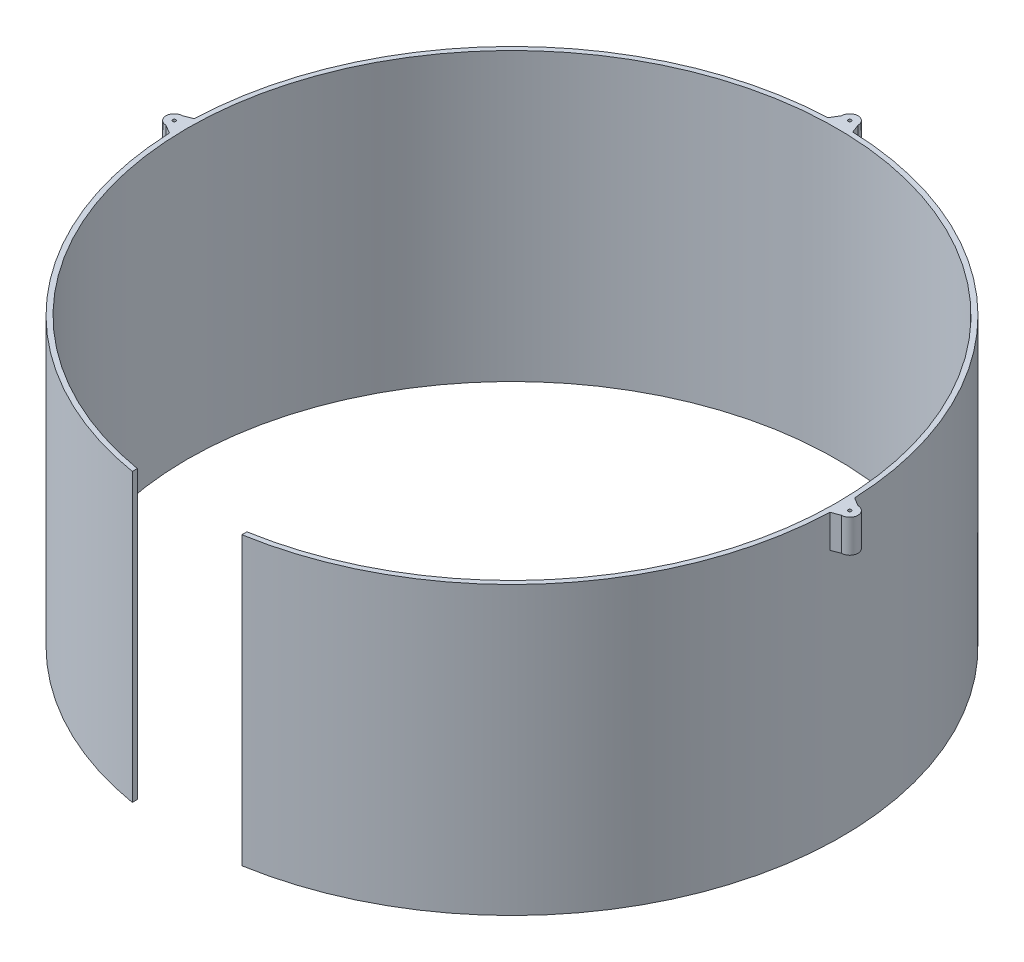
ISO-10303-21;
HEADER;
FILE_DESCRIPTION(('STEP AP214'),'2;1');
FILE_NAME('part.step','',(''),(''),'','','');
FILE_SCHEMA(('AUTOMOTIVE_DESIGN { 1 0 10303 214 1 1 1 1 }'));
ENDSEC;
DATA;
#1=APPLICATION_CONTEXT('core data for automotive mechanical design processes');
#2=APPLICATION_PROTOCOL_DEFINITION('international standard','automotive_design',2000,#1);
#3=PRODUCT_CONTEXT('',#1,'mechanical');
#4=PRODUCT('Part','Part','',(#3));
#5=PRODUCT_RELATED_PRODUCT_CATEGORY('part','',(#4));
#6=PRODUCT_DEFINITION_FORMATION('','',#4);
#7=PRODUCT_DEFINITION_CONTEXT('part definition',#1,'design');
#8=PRODUCT_DEFINITION('design','',#6,#7);
#9=PRODUCT_DEFINITION_SHAPE('','',#8);
#10=(LENGTH_UNIT() NAMED_UNIT(*) SI_UNIT(.MILLI.,.METRE.));
#11=(NAMED_UNIT(*) PLANE_ANGLE_UNIT() SI_UNIT($,.RADIAN.));
#12=(NAMED_UNIT(*) SI_UNIT($,.STERADIAN.) SOLID_ANGLE_UNIT());
#13=UNCERTAINTY_MEASURE_WITH_UNIT(LENGTH_MEASURE(1.E-05),#10,'distance_accuracy_value','');
#14=(GEOMETRIC_REPRESENTATION_CONTEXT(3) GLOBAL_UNCERTAINTY_ASSIGNED_CONTEXT((#13)) GLOBAL_UNIT_ASSIGNED_CONTEXT((#10,
#11,#12)) REPRESENTATION_CONTEXT('',''));
#15=CARTESIAN_POINT('',(0.,0.,0.));
#16=DIRECTION('',(0.,0.,1.));
#17=DIRECTION('',(1.,0.,0.));
#18=AXIS2_PLACEMENT_3D('',#15,#16,#17);
#19=CARTESIAN_POINT('',(0.,87.,0.));
#20=DIRECTION('',(0.,-1.,0.));
#21=DIRECTION('',(0.,0.,-1.));
#22=AXIS2_PLACEMENT_3D('',#19,#20,#21);
#23=CYLINDRICAL_SURFACE('',#22,98.5);
#24=CARTESIAN_POINT('',(0.,0.,0.));
#25=DIRECTION('',(0.,-1.,0.));
#26=DIRECTION('',(0.,0.,1.));
#27=AXIS2_PLACEMENT_3D('',#24,#25,#26);
#28=CIRCLE('',#27,98.5);
#29=CARTESIAN_POINT('',(-16.6342622863779,0.,97.0852785863438));
#30=VERTEX_POINT('',#29);
#31=CARTESIAN_POINT('',(16.6342622863779,0.,97.0852785863438));
#32=VERTEX_POINT('',#31);
#33=EDGE_CURVE('E295',#30,#32,#28,.T.);
#34=ORIENTED_EDGE('',*,*,#33,.T.);
#35=DIRECTION('',(0.,-1.,0.));
#36=VECTOR('',#35,1.);
#37=CARTESIAN_POINT('',(16.6342622863779,87.,97.0852785863438));
#38=LINE('',#37,#36);
#39=CARTESIAN_POINT('',(16.6342622863779,87.,97.0852785863438));
#40=VERTEX_POINT('',#39);
#41=EDGE_CURVE('E336',#40,#32,#38,.T.);
#42=ORIENTED_EDGE('',*,*,#41,.F.);
#43=CARTESIAN_POINT('',(0.,87.,0.));
#44=DIRECTION('',(0.,-1.,0.));
#45=DIRECTION('',(0.,0.,1.));
#46=AXIS2_PLACEMENT_3D('',#43,#44,#45);
#47=CIRCLE('',#46,98.5);
#48=CARTESIAN_POINT('',(-16.6342622863779,87.,97.0852785863438));
#49=VERTEX_POINT('',#48);
#50=EDGE_CURVE('E296',#49,#40,#47,.T.);
#51=ORIENTED_EDGE('',*,*,#50,.F.);
#52=DIRECTION('',(0.,-1.,0.));
#53=VECTOR('',#52,1.);
#54=CARTESIAN_POINT('',(-16.6342622863779,87.,97.0852785863438));
#55=LINE('',#54,#53);
#56=EDGE_CURVE('E313',#49,#30,#55,.T.);
#57=ORIENTED_EDGE('',*,*,#56,.T.);
#58=EDGE_LOOP('',(#34,#42,#51,#57));
#59=FACE_BOUND('',#58,.T.);
#60=ADVANCED_FACE('F45',(#59),#23,.F.);
#61=CARTESIAN_POINT('',(16.6342622863779,87.,97.0852785863438));
#62=DIRECTION('',(1.,0.,0.));
#63=DIRECTION('',(0.,0.,-1.));
#64=AXIS2_PLACEMENT_3D('',#61,#62,#63);
#65=PLANE('',#64);
#66=DIRECTION('',(0.,0.,1.));
#67=VECTOR('',#66,1.);
#68=CARTESIAN_POINT('',(16.6342622863779,0.,97.0852785863438));
#69=LINE('',#68,#67);
#70=CARTESIAN_POINT('',(16.6342622863779,0.,98.6068015817772));
#71=VERTEX_POINT('',#70);
#72=EDGE_CURVE('E317',#32,#71,#69,.T.);
#73=ORIENTED_EDGE('',*,*,#72,.T.);
#74=DIRECTION('',(0.,-1.,0.));
#75=VECTOR('',#74,1.);
#76=CARTESIAN_POINT('',(16.6342622863779,87.,98.6068015817772));
#77=LINE('',#76,#75);
#78=CARTESIAN_POINT('',(16.6342622863779,87.,98.6068015817772));
#79=VERTEX_POINT('',#78);
#80=EDGE_CURVE('E332',#79,#71,#77,.T.);
#81=ORIENTED_EDGE('',*,*,#80,.F.);
#82=DIRECTION('',(0.,0.,1.));
#83=VECTOR('',#82,1.);
#84=CARTESIAN_POINT('',(16.6342622863779,87.,97.0852785863438));
#85=LINE('',#84,#83);
#86=EDGE_CURVE('E300',#40,#79,#85,.T.);
#87=ORIENTED_EDGE('',*,*,#86,.F.);
#88=ORIENTED_EDGE('',*,*,#41,.T.);
#89=EDGE_LOOP('',(#73,#81,#87,#88));
#90=FACE_BOUND('',#89,.T.);
#91=ADVANCED_FACE('F374',(#90),#65,.F.);
#92=CARTESIAN_POINT('',(0.,87.,0.));
#93=DIRECTION('',(0.,-1.,0.));
#94=DIRECTION('',(0.,0.,-1.));
#95=AXIS2_PLACEMENT_3D('',#92,#93,#94);
#96=CYLINDRICAL_SURFACE('',#95,100.);
#97=CARTESIAN_POINT('',(0.,77.,0.));
#98=DIRECTION('',(0.,1.,0.));
#99=DIRECTION('',(0.,0.,1.));
#100=AXIS2_PLACEMENT_3D('',#97,#98,#99);
#101=CIRCLE('',#100,100.);
#102=CARTESIAN_POINT('',(3.48175720560747,77.,-99.9393684528835));
#103=VERTEX_POINT('',#102);
#104=CARTESIAN_POINT('',(-4.05153192682662,77.,-99.9178917363948));
#105=VERTEX_POINT('',#104);
#106=EDGE_CURVE('E11',#103,#105,#101,.T.);
#107=ORIENTED_EDGE('',*,*,#106,.F.);
#108=DIRECTION('',(0.,-1.,0.));
#109=VECTOR('',#108,1.);
#110=CARTESIAN_POINT('',(3.48175720560747,87.,-99.9393684528835));
#111=LINE('',#110,#109);
#112=CARTESIAN_POINT('',(3.48175720560747,87.,-99.9393684528835));
#113=VERTEX_POINT('',#112);
#114=EDGE_CURVE('E206',#103,#113,#111,.F.);
#115=ORIENTED_EDGE('',*,*,#114,.T.);
#116=CARTESIAN_POINT('',(0.,87.,0.));
#117=DIRECTION('',(0.,1.,0.));
#118=DIRECTION('',(0.,0.,1.));
#119=AXIS2_PLACEMENT_3D('',#116,#117,#118);
#120=CIRCLE('',#119,100.);
#121=CARTESIAN_POINT('',(99.9178917363948,87.,-4.05153192682659));
#122=VERTEX_POINT('',#121);
#123=EDGE_CURVE('E163',#122,#113,#120,.T.);
#124=ORIENTED_EDGE('',*,*,#123,.F.);
#125=DIRECTION('',(0.,-1.,0.));
#126=VECTOR('',#125,1.);
#127=CARTESIAN_POINT('',(99.9178917363948,87.,-4.05153192682657));
#128=LINE('',#127,#126);
#129=CARTESIAN_POINT('',(99.9178917363948,77.,-4.05153192682657));
#130=VERTEX_POINT('',#129);
#131=EDGE_CURVE('E240',#122,#130,#128,.T.);
#132=ORIENTED_EDGE('',*,*,#131,.T.);
#133=CARTESIAN_POINT('',(0.,77.,0.));
#134=DIRECTION('',(0.,1.,0.));
#135=DIRECTION('',(0.,0.,1.));
#136=AXIS2_PLACEMENT_3D('',#133,#134,#135);
#137=CIRCLE('',#136,100.);
#138=CARTESIAN_POINT('',(99.9393684528835,77.,3.48175720560755));
#139=VERTEX_POINT('',#138);
#140=EDGE_CURVE('E53',#139,#130,#137,.T.);
#141=ORIENTED_EDGE('',*,*,#140,.F.);
#142=DIRECTION('',(0.,-1.,0.));
#143=VECTOR('',#142,1.);
#144=CARTESIAN_POINT('',(99.9393684528835,87.,3.48175720560755));
#145=LINE('',#144,#143);
#146=CARTESIAN_POINT('',(99.9393684528835,87.,3.48175720560754));
#147=VERTEX_POINT('',#146);
#148=EDGE_CURVE('E247',#139,#147,#145,.F.);
#149=ORIENTED_EDGE('',*,*,#148,.T.);
#150=EDGE_CURVE('E305',#79,#147,#120,.T.);
#151=ORIENTED_EDGE('',*,*,#150,.F.);
#152=ORIENTED_EDGE('',*,*,#80,.T.);
#153=CARTESIAN_POINT('',(0.,0.,0.));
#154=DIRECTION('',(0.,1.,0.));
#155=DIRECTION('',(0.,0.,1.));
#156=AXIS2_PLACEMENT_3D('',#153,#154,#155);
#157=CIRCLE('',#156,100.);
#158=CARTESIAN_POINT('',(-16.6342622863779,0.,98.6068015817772));
#159=VERTEX_POINT('',#158);
#160=EDGE_CURVE('E320',#71,#159,#157,.T.);
#161=ORIENTED_EDGE('',*,*,#160,.T.);
#162=DIRECTION('',(0.,-1.,0.));
#163=VECTOR('',#162,1.);
#164=CARTESIAN_POINT('',(-16.6342622863779,87.,98.6068015817772));
#165=LINE('',#164,#163);
#166=CARTESIAN_POINT('',(-16.6342622863779,87.,98.6068015817772));
#167=VERTEX_POINT('',#166);
#168=EDGE_CURVE('E328',#167,#159,#165,.T.);
#169=ORIENTED_EDGE('',*,*,#168,.F.);
#170=CARTESIAN_POINT('',(-99.9178917363948,87.,4.05153192682661));
#171=VERTEX_POINT('',#170);
#172=EDGE_CURVE('E304',#171,#167,#120,.T.);
#173=ORIENTED_EDGE('',*,*,#172,.F.);
#174=DIRECTION('',(0.,-1.,0.));
#175=VECTOR('',#174,1.);
#176=CARTESIAN_POINT('',(-99.9178917363948,87.,4.05153192682661));
#177=LINE('',#176,#175);
#178=CARTESIAN_POINT('',(-99.9178917363948,77.,4.05153192682661));
#179=VERTEX_POINT('',#178);
#180=EDGE_CURVE('E285',#171,#179,#177,.T.);
#181=ORIENTED_EDGE('',*,*,#180,.T.);
#182=CARTESIAN_POINT('',(0.,77.,0.));
#183=DIRECTION('',(0.,1.,0.));
#184=DIRECTION('',(0.,0.,1.));
#185=AXIS2_PLACEMENT_3D('',#182,#183,#184);
#186=CIRCLE('',#185,100.);
#187=CARTESIAN_POINT('',(-99.9393684528835,77.,-3.4817572056075));
#188=VERTEX_POINT('',#187);
#189=EDGE_CURVE('E340',#188,#179,#186,.T.);
#190=ORIENTED_EDGE('',*,*,#189,.F.);
#191=DIRECTION('',(0.,-1.,0.));
#192=VECTOR('',#191,1.);
#193=CARTESIAN_POINT('',(-99.9393684528835,87.,-3.4817572056075));
#194=LINE('',#193,#192);
#195=CARTESIAN_POINT('',(-99.9393684528835,87.,-3.4817572056075));
#196=VERTEX_POINT('',#195);
#197=EDGE_CURVE('E291',#188,#196,#194,.F.);
#198=ORIENTED_EDGE('',*,*,#197,.T.);
#199=CARTESIAN_POINT('',(-4.05153192682663,87.,-99.9178917363948));
#200=VERTEX_POINT('',#199);
#201=EDGE_CURVE('E310',#200,#196,#120,.T.);
#202=ORIENTED_EDGE('',*,*,#201,.F.);
#203=DIRECTION('',(0.,-1.,0.));
#204=VECTOR('',#203,1.);
#205=CARTESIAN_POINT('',(-4.05153192682663,87.,-99.9178917363948));
#206=LINE('',#205,#204);
#207=EDGE_CURVE('E201',#200,#105,#206,.T.);
#208=ORIENTED_EDGE('',*,*,#207,.T.);
#209=EDGE_LOOP('',(#107,#115,#124,#132,#141,#149,#151,#152,#161,#169,#173,#181,#190,#198,#202,#208));
#210=FACE_BOUND('',#209,.T.);
#211=ADVANCED_FACE('F353',(#210),#96,.T.);
#212=CARTESIAN_POINT('',(-16.6342622863779,87.,97.0852785863438));
#213=DIRECTION('',(-1.,0.,0.));
#214=DIRECTION('',(0.,0.,1.));
#215=AXIS2_PLACEMENT_3D('',#212,#213,#214);
#216=PLANE('',#215);
#217=DIRECTION('',(0.,0.,-1.));
#218=VECTOR('',#217,1.);
#219=CARTESIAN_POINT('',(-16.6342622863779,0.,97.0852785863438));
#220=LINE('',#219,#218);
#221=EDGE_CURVE('E301',#159,#30,#220,.T.);
#222=ORIENTED_EDGE('',*,*,#221,.T.);
#223=ORIENTED_EDGE('',*,*,#56,.F.);
#224=DIRECTION('',(0.,0.,-1.));
#225=VECTOR('',#224,1.);
#226=CARTESIAN_POINT('',(-16.6342622863779,87.,97.0852785863438));
#227=LINE('',#226,#225);
#228=EDGE_CURVE('E309',#167,#49,#227,.T.);
#229=ORIENTED_EDGE('',*,*,#228,.F.);
#230=ORIENTED_EDGE('',*,*,#168,.T.);
#231=EDGE_LOOP('',(#222,#223,#229,#230));
#232=FACE_BOUND('',#231,.T.);
#233=ADVANCED_FACE('F366',(#232),#216,.F.);
#234=CARTESIAN_POINT('',(0.,87.,0.));
#235=DIRECTION('',(0.,1.,0.));
#236=DIRECTION('',(0.,0.,1.));
#237=AXIS2_PLACEMENT_3D('',#234,#235,#236);
#238=PLANE('',#237);
#239=ORIENTED_EDGE('',*,*,#123,.T.);
#240=DIRECTION('',(-0.357993803681993,0.,-0.933723961631755));
#241=VECTOR('',#240,1.);
#242=CARTESIAN_POINT('',(2.5,87.,-102.5));
#243=LINE('',#242,#241);
#244=CARTESIAN_POINT('',(2.5,87.,-102.5));
#245=VERTEX_POINT('',#244);
#246=EDGE_CURVE('E156',#113,#245,#243,.T.);
#247=ORIENTED_EDGE('',*,*,#246,.T.);
#248=CARTESIAN_POINT('',(0.,87.,-102.5));
#249=DIRECTION('',(0.,1.,0.));
#250=DIRECTION('',(0.,0.,1.));
#251=AXIS2_PLACEMENT_3D('',#248,#249,#250);
#252=CIRCLE('',#251,2.5);
#253=CARTESIAN_POINT('',(-2.5,87.,-102.5));
#254=VERTEX_POINT('',#253);
#255=EDGE_CURVE('E161',#245,#254,#252,.T.);
#256=ORIENTED_EDGE('',*,*,#255,.T.);
#257=DIRECTION('',(-0.515048991321095,0.,0.857160741366007));
#258=VECTOR('',#257,1.);
#259=CARTESIAN_POINT('',(-2.5,87.,-102.5));
#260=LINE('',#259,#258);
#261=EDGE_CURVE('E60',#254,#200,#260,.T.);
#262=ORIENTED_EDGE('',*,*,#261,.T.);
#263=ORIENTED_EDGE('',*,*,#201,.T.);
#264=DIRECTION('',(-0.933723961631753,0.,0.357993803681998));
#265=VECTOR('',#264,1.);
#266=CARTESIAN_POINT('',(-102.5,87.,-2.5));
#267=LINE('',#266,#265);
#268=CARTESIAN_POINT('',(-102.5,87.,-2.5));
#269=VERTEX_POINT('',#268);
#270=EDGE_CURVE('E265',#196,#269,#267,.T.);
#271=ORIENTED_EDGE('',*,*,#270,.T.);
#272=CARTESIAN_POINT('',(-102.5,87.,0.));
#273=DIRECTION('',(0.,1.,0.));
#274=DIRECTION('',(0.,0.,1.));
#275=AXIS2_PLACEMENT_3D('',#272,#273,#274);
#276=CIRCLE('',#275,2.5);
#277=CARTESIAN_POINT('',(-102.5,87.,2.5));
#278=VERTEX_POINT('',#277);
#279=EDGE_CURVE('E256',#269,#278,#276,.T.);
#280=ORIENTED_EDGE('',*,*,#279,.T.);
#281=DIRECTION('',(0.857160741366007,0.,0.515048991321095));
#282=VECTOR('',#281,1.);
#283=CARTESIAN_POINT('',(-102.5,87.,2.5));
#284=LINE('',#283,#282);
#285=EDGE_CURVE('E276',#278,#171,#284,.T.);
#286=ORIENTED_EDGE('',*,*,#285,.T.);
#287=ORIENTED_EDGE('',*,*,#172,.T.);
#288=ORIENTED_EDGE('',*,*,#228,.T.);
#289=ORIENTED_EDGE('',*,*,#50,.T.);
#290=ORIENTED_EDGE('',*,*,#86,.T.);
#291=ORIENTED_EDGE('',*,*,#150,.T.);
#292=DIRECTION('',(0.933723961631751,0.,-0.357993803682004));
#293=VECTOR('',#292,1.);
#294=CARTESIAN_POINT('',(102.5,87.,2.5));
#295=LINE('',#294,#293);
#296=CARTESIAN_POINT('',(102.5,87.,2.5));
#297=VERTEX_POINT('',#296);
#298=EDGE_CURVE('E217',#147,#297,#295,.T.);
#299=ORIENTED_EDGE('',*,*,#298,.T.);
#300=CARTESIAN_POINT('',(102.5,87.,0.));
#301=DIRECTION('',(0.,1.,0.));
#302=DIRECTION('',(0.,0.,1.));
#303=AXIS2_PLACEMENT_3D('',#300,#301,#302);
#304=CIRCLE('',#303,2.5);
#305=CARTESIAN_POINT('',(102.5,87.,-2.49999999999999));
#306=VERTEX_POINT('',#305);
#307=EDGE_CURVE('E223',#297,#306,#304,.T.);
#308=ORIENTED_EDGE('',*,*,#307,.T.);
#309=DIRECTION('',(-0.857160741366011,0.,-0.515048991321089));
#310=VECTOR('',#309,1.);
#311=CARTESIAN_POINT('',(102.5,87.,-2.49999999999999));
#312=LINE('',#311,#310);
#313=EDGE_CURVE('E67',#306,#122,#312,.T.);
#314=ORIENTED_EDGE('',*,*,#313,.T.);
#315=EDGE_LOOP('',(#239,#247,#256,#262,#263,#271,#280,#286,#287,#288,#289,#290,#291,#299,#308,#314));
#316=FACE_BOUND('',#315,.T.);
#317=CARTESIAN_POINT('',(-102.5,87.,0.));
#318=DIRECTION('',(0.,1.,0.));
#319=DIRECTION('',(0.,0.,1.));
#320=AXIS2_PLACEMENT_3D('',#317,#318,#319);
#321=CIRCLE('',#320,0.499999999999973);
#322=CARTESIAN_POINT('',(-102.5,87.,0.499999999999973));
#323=VERTEX_POINT('',#322);
#324=EDGE_CURVE('E251',#323,#323,#321,.T.);
#325=ORIENTED_EDGE('',*,*,#324,.F.);
#326=EDGE_LOOP('',(#325));
#327=FACE_BOUND('',#326,.T.);
#328=CARTESIAN_POINT('',(102.5,87.,0.));
#329=DIRECTION('',(0.,1.,0.));
#330=DIRECTION('',(0.,0.,1.));
#331=AXIS2_PLACEMENT_3D('',#328,#329,#330);
#332=CIRCLE('',#331,0.499999999999999);
#333=CARTESIAN_POINT('',(102.5,87.,0.499999999999999));
#334=VERTEX_POINT('',#333);
#335=EDGE_CURVE('E236',#334,#334,#332,.T.);
#336=ORIENTED_EDGE('',*,*,#335,.F.);
#337=EDGE_LOOP('',(#336));
#338=FACE_BOUND('',#337,.T.);
#339=CARTESIAN_POINT('',(0.,87.,-102.5));
#340=DIRECTION('',(0.,1.,0.));
#341=DIRECTION('',(0.,0.,1.));
#342=AXIS2_PLACEMENT_3D('',#339,#340,#341);
#343=CIRCLE('',#342,0.499999999999999);
#344=CARTESIAN_POINT('',(0.,87.,-102.));
#345=VERTEX_POINT('',#344);
#346=EDGE_CURVE('E187',#345,#345,#343,.T.);
#347=ORIENTED_EDGE('',*,*,#346,.F.);
#348=EDGE_LOOP('',(#347));
#349=FACE_BOUND('',#348,.T.);
#350=ADVANCED_FACE('F158',(#316,#327,#338,#349),#238,.T.);
#351=CARTESIAN_POINT('',(0.,0.,0.));
#352=DIRECTION('',(0.,1.,0.));
#353=DIRECTION('',(0.,0.,1.));
#354=AXIS2_PLACEMENT_3D('',#351,#352,#353);
#355=PLANE('',#354);
#356=ORIENTED_EDGE('',*,*,#33,.F.);
#357=ORIENTED_EDGE('',*,*,#221,.F.);
#358=ORIENTED_EDGE('',*,*,#160,.F.);
#359=ORIENTED_EDGE('',*,*,#72,.F.);
#360=EDGE_LOOP('',(#356,#357,#358,#359));
#361=FACE_BOUND('',#360,.T.);
#362=ADVANCED_FACE('F403',(#361),#355,.F.);
#363=CARTESIAN_POINT('',(-102.5,77.,-2.5));
#364=DIRECTION('',(-0.357993803681998,0.,-0.933723961631753));
#365=DIRECTION('',(-0.933723961631753,0.,0.357993803681998));
#366=AXIS2_PLACEMENT_3D('',#363,#364,#365);
#367=PLANE('',#366);
#368=ORIENTED_EDGE('',*,*,#197,.F.);
#369=DIRECTION('',(-0.933723961631753,0.,0.357993803681998));
#370=VECTOR('',#369,1.);
#371=CARTESIAN_POINT('',(-102.5,77.,-2.5));
#372=LINE('',#371,#370);
#373=CARTESIAN_POINT('',(-102.5,77.,-2.5));
#374=VERTEX_POINT('',#373);
#375=EDGE_CURVE('E269',#188,#374,#372,.T.);
#376=ORIENTED_EDGE('',*,*,#375,.T.);
#377=DIRECTION('',(0.,1.,0.));
#378=VECTOR('',#377,1.);
#379=CARTESIAN_POINT('',(-102.5,77.,-2.5));
#380=LINE('',#379,#378);
#381=EDGE_CURVE('E281',#374,#269,#380,.T.);
#382=ORIENTED_EDGE('',*,*,#381,.T.);
#383=ORIENTED_EDGE('',*,*,#270,.F.);
#384=EDGE_LOOP('',(#368,#376,#382,#383));
#385=FACE_BOUND('',#384,.T.);
#386=ADVANCED_FACE('F406',(#385),#367,.T.);
#387=CARTESIAN_POINT('',(-102.5,77.,2.5));
#388=DIRECTION('',(-0.515048991321095,0.,0.857160741366007));
#389=DIRECTION('',(0.857160741366007,0.,0.515048991321095));
#390=AXIS2_PLACEMENT_3D('',#387,#388,#389);
#391=PLANE('',#390);
#392=ORIENTED_EDGE('',*,*,#180,.F.);
#393=ORIENTED_EDGE('',*,*,#285,.F.);
#394=DIRECTION('',(0.,1.,0.));
#395=VECTOR('',#394,1.);
#396=CARTESIAN_POINT('',(-102.5,77.,2.5));
#397=LINE('',#396,#395);
#398=CARTESIAN_POINT('',(-102.5,77.,2.5));
#399=VERTEX_POINT('',#398);
#400=EDGE_CURVE('E272',#399,#278,#397,.T.);
#401=ORIENTED_EDGE('',*,*,#400,.F.);
#402=DIRECTION('',(0.857160741366007,0.,0.515048991321095));
#403=VECTOR('',#402,1.);
#404=CARTESIAN_POINT('',(-102.5,77.,2.5));
#405=LINE('',#404,#403);
#406=EDGE_CURVE('E264',#399,#179,#405,.T.);
#407=ORIENTED_EDGE('',*,*,#406,.T.);
#408=EDGE_LOOP('',(#392,#393,#401,#407));
#409=FACE_BOUND('',#408,.T.);
#410=ADVANCED_FACE('F414',(#409),#391,.T.);
#411=CARTESIAN_POINT('',(-102.5,77.,0.));
#412=DIRECTION('',(0.,1.,0.));
#413=DIRECTION('',(0.,0.,1.));
#414=AXIS2_PLACEMENT_3D('',#411,#412,#413);
#415=CYLINDRICAL_SURFACE('',#414,2.5);
#416=ORIENTED_EDGE('',*,*,#279,.F.);
#417=ORIENTED_EDGE('',*,*,#381,.F.);
#418=CARTESIAN_POINT('',(-102.5,77.,0.));
#419=DIRECTION('',(0.,1.,0.));
#420=DIRECTION('',(0.,0.,1.));
#421=AXIS2_PLACEMENT_3D('',#418,#419,#420);
#422=CIRCLE('',#421,2.5);
#423=EDGE_CURVE('E260',#374,#399,#422,.T.);
#424=ORIENTED_EDGE('',*,*,#423,.T.);
#425=ORIENTED_EDGE('',*,*,#400,.T.);
#426=EDGE_LOOP('',(#416,#417,#424,#425));
#427=FACE_BOUND('',#426,.T.);
#428=ADVANCED_FACE('F410',(#427),#415,.T.);
#429=CARTESIAN_POINT('',(-102.5,77.,0.));
#430=DIRECTION('',(0.,1.,0.));
#431=DIRECTION('',(0.,0.,1.));
#432=AXIS2_PLACEMENT_3D('',#429,#430,#431);
#433=PLANE('',#432);
#434=CARTESIAN_POINT('',(-102.5,77.,0.));
#435=DIRECTION('',(0.,1.,0.));
#436=DIRECTION('',(0.,0.,1.));
#437=AXIS2_PLACEMENT_3D('',#434,#435,#436);
#438=CIRCLE('',#437,0.499999999999973);
#439=CARTESIAN_POINT('',(-102.5,77.,0.499999999999973));
#440=VERTEX_POINT('',#439);
#441=EDGE_CURVE('E252',#440,#440,#438,.T.);
#442=ORIENTED_EDGE('',*,*,#441,.T.);
#443=EDGE_LOOP('',(#442));
#444=FACE_BOUND('',#443,.T.);
#445=ORIENTED_EDGE('',*,*,#375,.F.);
#446=ORIENTED_EDGE('',*,*,#189,.T.);
#447=ORIENTED_EDGE('',*,*,#406,.F.);
#448=ORIENTED_EDGE('',*,*,#423,.F.);
#449=EDGE_LOOP('',(#445,#446,#447,#448));
#450=FACE_BOUND('',#449,.T.);
#451=ADVANCED_FACE('F413',(#444,#450),#433,.F.);
#452=CARTESIAN_POINT('',(-102.5,77.,0.));
#453=DIRECTION('',(0.,1.,0.));
#454=DIRECTION('',(0.,0.,1.));
#455=AXIS2_PLACEMENT_3D('',#452,#453,#454);
#456=CYLINDRICAL_SURFACE('',#455,0.499999999999973);
#457=ORIENTED_EDGE('',*,*,#441,.F.);
#458=EDGE_LOOP('',(#457));
#459=FACE_BOUND('',#458,.T.);
#460=ORIENTED_EDGE('',*,*,#324,.T.);
#461=EDGE_LOOP('',(#460));
#462=FACE_BOUND('',#461,.T.);
#463=ADVANCED_FACE('F424',(#459,#462),#456,.F.);
#464=CARTESIAN_POINT('',(102.5,77.,2.5));
#465=DIRECTION('',(0.357993803682004,0.,0.933723961631751));
#466=DIRECTION('',(0.933723961631751,0.,-0.357993803682004));
#467=AXIS2_PLACEMENT_3D('',#464,#465,#466);
#468=PLANE('',#467);
#469=ORIENTED_EDGE('',*,*,#148,.F.);
#470=DIRECTION('',(0.933723961631751,0.,-0.357993803682004));
#471=VECTOR('',#470,1.);
#472=CARTESIAN_POINT('',(102.5,77.,2.5));
#473=LINE('',#472,#471);
#474=CARTESIAN_POINT('',(102.5,77.,2.5));
#475=VERTEX_POINT('',#474);
#476=EDGE_CURVE('E213',#139,#475,#473,.T.);
#477=ORIENTED_EDGE('',*,*,#476,.T.);
#478=DIRECTION('',(0.,1.,0.));
#479=VECTOR('',#478,1.);
#480=CARTESIAN_POINT('',(102.5,77.,2.5));
#481=LINE('',#480,#479);
#482=EDGE_CURVE('E209',#475,#297,#481,.T.);
#483=ORIENTED_EDGE('',*,*,#482,.T.);
#484=ORIENTED_EDGE('',*,*,#298,.F.);
#485=EDGE_LOOP('',(#469,#477,#483,#484));
#486=FACE_BOUND('',#485,.T.);
#487=ADVANCED_FACE('F376',(#486),#468,.T.);
#488=CARTESIAN_POINT('',(102.5,77.,-2.49999999999999));
#489=DIRECTION('',(0.515048991321089,0.,-0.857160741366011));
#490=DIRECTION('',(-0.857160741366011,0.,-0.515048991321089));
#491=AXIS2_PLACEMENT_3D('',#488,#489,#490);
#492=PLANE('',#491);
#493=ORIENTED_EDGE('',*,*,#131,.F.);
#494=ORIENTED_EDGE('',*,*,#313,.F.);
#495=DIRECTION('',(0.,1.,0.));
#496=VECTOR('',#495,1.);
#497=CARTESIAN_POINT('',(102.5,77.,-2.49999999999999));
#498=LINE('',#497,#496);
#499=CARTESIAN_POINT('',(102.5,77.,-2.49999999999999));
#500=VERTEX_POINT('',#499);
#501=EDGE_CURVE('E210',#500,#306,#498,.T.);
#502=ORIENTED_EDGE('',*,*,#501,.F.);
#503=DIRECTION('',(-0.857160741366011,0.,-0.515048991321089));
#504=VECTOR('',#503,1.);
#505=CARTESIAN_POINT('',(102.5,77.,-2.49999999999999));
#506=LINE('',#505,#504);
#507=EDGE_CURVE('E229',#500,#130,#506,.T.);
#508=ORIENTED_EDGE('',*,*,#507,.T.);
#509=EDGE_LOOP('',(#493,#494,#502,#508));
#510=FACE_BOUND('',#509,.T.);
#511=ADVANCED_FACE('F351',(#510),#492,.T.);
#512=CARTESIAN_POINT('',(102.5,77.,0.));
#513=DIRECTION('',(0.,1.,0.));
#514=DIRECTION('',(0.,0.,1.));
#515=AXIS2_PLACEMENT_3D('',#512,#513,#514);
#516=CYLINDRICAL_SURFACE('',#515,2.5);
#517=ORIENTED_EDGE('',*,*,#307,.F.);
#518=ORIENTED_EDGE('',*,*,#482,.F.);
#519=CARTESIAN_POINT('',(102.5,77.,0.));
#520=DIRECTION('',(0.,1.,0.));
#521=DIRECTION('',(0.,0.,1.));
#522=AXIS2_PLACEMENT_3D('',#519,#520,#521);
#523=CIRCLE('',#522,2.5);
#524=EDGE_CURVE('E220',#475,#500,#523,.T.);
#525=ORIENTED_EDGE('',*,*,#524,.T.);
#526=ORIENTED_EDGE('',*,*,#501,.T.);
#527=EDGE_LOOP('',(#517,#518,#525,#526));
#528=FACE_BOUND('',#527,.T.);
#529=ADVANCED_FACE('F380',(#528),#516,.T.);
#530=CARTESIAN_POINT('',(102.5,77.,0.));
#531=DIRECTION('',(0.,1.,0.));
#532=DIRECTION('',(0.,0.,1.));
#533=AXIS2_PLACEMENT_3D('',#530,#531,#532);
#534=PLANE('',#533);
#535=CARTESIAN_POINT('',(102.5,77.,0.));
#536=DIRECTION('',(0.,1.,0.));
#537=DIRECTION('',(0.,0.,1.));
#538=AXIS2_PLACEMENT_3D('',#535,#536,#537);
#539=CIRCLE('',#538,0.499999999999999);
#540=CARTESIAN_POINT('',(102.5,77.,0.499999999999999));
#541=VERTEX_POINT('',#540);
#542=EDGE_CURVE('E226',#541,#541,#539,.T.);
#543=ORIENTED_EDGE('',*,*,#542,.T.);
#544=EDGE_LOOP('',(#543));
#545=FACE_BOUND('',#544,.T.);
#546=ORIENTED_EDGE('',*,*,#476,.F.);
#547=ORIENTED_EDGE('',*,*,#140,.T.);
#548=ORIENTED_EDGE('',*,*,#507,.F.);
#549=ORIENTED_EDGE('',*,*,#524,.F.);
#550=EDGE_LOOP('',(#546,#547,#548,#549));
#551=FACE_BOUND('',#550,.T.);
#552=ADVANCED_FACE('F347',(#545,#551),#534,.F.);
#553=CARTESIAN_POINT('',(102.5,77.,0.));
#554=DIRECTION('',(0.,1.,0.));
#555=DIRECTION('',(0.,0.,1.));
#556=AXIS2_PLACEMENT_3D('',#553,#554,#555);
#557=CYLINDRICAL_SURFACE('',#556,0.499999999999999);
#558=ORIENTED_EDGE('',*,*,#542,.F.);
#559=EDGE_LOOP('',(#558));
#560=FACE_BOUND('',#559,.T.);
#561=ORIENTED_EDGE('',*,*,#335,.T.);
#562=EDGE_LOOP('',(#561));
#563=FACE_BOUND('',#562,.T.);
#564=ADVANCED_FACE('F387',(#560,#563),#557,.F.);
#565=CARTESIAN_POINT('',(2.5,77.,-102.5));
#566=DIRECTION('',(0.933723961631755,0.,-0.357993803681993));
#567=DIRECTION('',(-0.357993803681993,0.,-0.933723961631755));
#568=AXIS2_PLACEMENT_3D('',#565,#566,#567);
#569=PLANE('',#568);
#570=ORIENTED_EDGE('',*,*,#114,.F.);
#571=DIRECTION('',(-0.357993803681993,0.,-0.933723961631755));
#572=VECTOR('',#571,1.);
#573=CARTESIAN_POINT('',(2.5,77.,-102.5));
#574=LINE('',#573,#572);
#575=CARTESIAN_POINT('',(2.5,77.,-102.5));
#576=VERTEX_POINT('',#575);
#577=EDGE_CURVE('E173',#103,#576,#574,.T.);
#578=ORIENTED_EDGE('',*,*,#577,.T.);
#579=DIRECTION('',(0.,1.,0.));
#580=VECTOR('',#579,1.);
#581=CARTESIAN_POINT('',(2.5,77.,-102.5));
#582=LINE('',#581,#580);
#583=EDGE_CURVE('E170',#576,#245,#582,.T.);
#584=ORIENTED_EDGE('',*,*,#583,.T.);
#585=ORIENTED_EDGE('',*,*,#246,.F.);
#586=EDGE_LOOP('',(#570,#578,#584,#585));
#587=FACE_BOUND('',#586,.T.);
#588=ADVANCED_FACE('F171',(#587),#569,.T.);
#589=CARTESIAN_POINT('',(-2.5,77.,-102.5));
#590=DIRECTION('',(-0.857160741366007,0.,-0.515048991321095));
#591=DIRECTION('',(-0.515048991321095,0.,0.857160741366007));
#592=AXIS2_PLACEMENT_3D('',#589,#590,#591);
#593=PLANE('',#592);
#594=ORIENTED_EDGE('',*,*,#207,.F.);
#595=ORIENTED_EDGE('',*,*,#261,.F.);
#596=DIRECTION('',(0.,1.,0.));
#597=VECTOR('',#596,1.);
#598=CARTESIAN_POINT('',(-2.5,77.,-102.5));
#599=LINE('',#598,#597);
#600=CARTESIAN_POINT('',(-2.5,77.,-102.5));
#601=VERTEX_POINT('',#600);
#602=EDGE_CURVE('E178',#601,#254,#599,.T.);
#603=ORIENTED_EDGE('',*,*,#602,.F.);
#604=DIRECTION('',(-0.515048991321095,0.,0.857160741366007));
#605=VECTOR('',#604,1.);
#606=CARTESIAN_POINT('',(-2.5,77.,-102.5));
#607=LINE('',#606,#605);
#608=EDGE_CURVE('E193',#601,#105,#607,.T.);
#609=ORIENTED_EDGE('',*,*,#608,.T.);
#610=EDGE_LOOP('',(#594,#595,#603,#609));
#611=FACE_BOUND('',#610,.T.);
#612=ADVANCED_FACE('F468',(#611),#593,.T.);
#613=CARTESIAN_POINT('',(0.,77.,-102.5));
#614=DIRECTION('',(0.,1.,0.));
#615=DIRECTION('',(0.,0.,1.));
#616=AXIS2_PLACEMENT_3D('',#613,#614,#615);
#617=CYLINDRICAL_SURFACE('',#616,2.5);
#618=ORIENTED_EDGE('',*,*,#255,.F.);
#619=ORIENTED_EDGE('',*,*,#583,.F.);
#620=CARTESIAN_POINT('',(0.,77.,-102.5));
#621=DIRECTION('',(0.,1.,0.));
#622=DIRECTION('',(0.,0.,1.));
#623=AXIS2_PLACEMENT_3D('',#620,#621,#622);
#624=CIRCLE('',#623,2.5);
#625=EDGE_CURVE('E167',#576,#601,#624,.T.);
#626=ORIENTED_EDGE('',*,*,#625,.T.);
#627=ORIENTED_EDGE('',*,*,#602,.T.);
#628=EDGE_LOOP('',(#618,#619,#626,#627));
#629=FACE_BOUND('',#628,.T.);
#630=ADVANCED_FACE('F180',(#629),#617,.T.);
#631=CARTESIAN_POINT('',(0.,77.,-102.5));
#632=DIRECTION('',(0.,1.,0.));
#633=DIRECTION('',(0.,0.,1.));
#634=AXIS2_PLACEMENT_3D('',#631,#632,#633);
#635=PLANE('',#634);
#636=CARTESIAN_POINT('',(0.,77.,-102.5));
#637=DIRECTION('',(0.,1.,0.));
#638=DIRECTION('',(0.,0.,1.));
#639=AXIS2_PLACEMENT_3D('',#636,#637,#638);
#640=CIRCLE('',#639,0.499999999999999);
#641=CARTESIAN_POINT('',(0.,77.,-102.));
#642=VERTEX_POINT('',#641);
#643=EDGE_CURVE('E182',#642,#642,#640,.T.);
#644=ORIENTED_EDGE('',*,*,#643,.T.);
#645=EDGE_LOOP('',(#644));
#646=FACE_BOUND('',#645,.T.);
#647=ORIENTED_EDGE('',*,*,#577,.F.);
#648=ORIENTED_EDGE('',*,*,#106,.T.);
#649=ORIENTED_EDGE('',*,*,#608,.F.);
#650=ORIENTED_EDGE('',*,*,#625,.F.);
#651=EDGE_LOOP('',(#647,#648,#649,#650));
#652=FACE_BOUND('',#651,.T.);
#653=ADVANCED_FACE('F486',(#646,#652),#635,.F.);
#654=CARTESIAN_POINT('',(0.,77.,-102.5));
#655=DIRECTION('',(0.,1.,0.));
#656=DIRECTION('',(0.,0.,1.));
#657=AXIS2_PLACEMENT_3D('',#654,#655,#656);
#658=CYLINDRICAL_SURFACE('',#657,0.499999999999999);
#659=ORIENTED_EDGE('',*,*,#643,.F.);
#660=EDGE_LOOP('',(#659));
#661=FACE_BOUND('',#660,.T.);
#662=ORIENTED_EDGE('',*,*,#346,.T.);
#663=EDGE_LOOP('',(#662));
#664=FACE_BOUND('',#663,.T.);
#665=ADVANCED_FACE('F495',(#661,#664),#658,.F.);
#666=CLOSED_SHELL('',(#60,#91,#211,#233,#350,#362,#386,#410,#428,#451,#463,#487,#511,#529,#552,
#564,#588,#612,#630,#653,#665));
#667=MANIFOLD_SOLID_BREP('B2',#666);
#668=ADVANCED_BREP_SHAPE_REPRESENTATION('',(#18,#667),#14);
#669=SHAPE_DEFINITION_REPRESENTATION(#9,#668);
ENDSEC;
END-ISO-10303-21;
